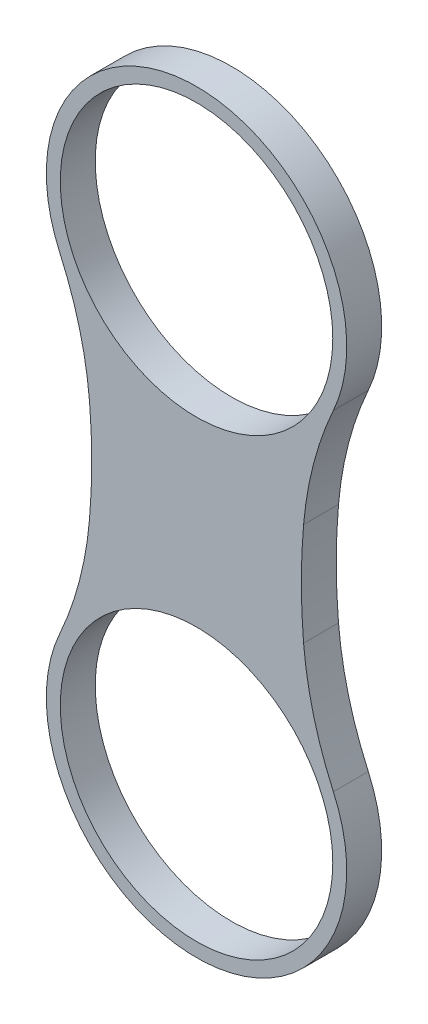
ISO-10303-21;
HEADER;
FILE_DESCRIPTION(('STEP AP214'),'2;1');
FILE_NAME('part.step','',(''),(''),'','','');
FILE_SCHEMA(('AUTOMOTIVE_DESIGN { 1 0 10303 214 1 1 1 1 }'));
ENDSEC;
DATA;
#1=APPLICATION_CONTEXT('core data for automotive mechanical design processes');
#2=APPLICATION_PROTOCOL_DEFINITION('international standard','automotive_design',2000,#1);
#3=PRODUCT_CONTEXT('',#1,'mechanical');
#4=PRODUCT('Part','Part','',(#3));
#5=PRODUCT_RELATED_PRODUCT_CATEGORY('part','',(#4));
#6=PRODUCT_DEFINITION_FORMATION('','',#4);
#7=PRODUCT_DEFINITION_CONTEXT('part definition',#1,'design');
#8=PRODUCT_DEFINITION('design','',#6,#7);
#9=PRODUCT_DEFINITION_SHAPE('','',#8);
#10=(LENGTH_UNIT() NAMED_UNIT(*) SI_UNIT(.MILLI.,.METRE.));
#11=(NAMED_UNIT(*) PLANE_ANGLE_UNIT() SI_UNIT($,.RADIAN.));
#12=(NAMED_UNIT(*) SI_UNIT($,.STERADIAN.) SOLID_ANGLE_UNIT());
#13=UNCERTAINTY_MEASURE_WITH_UNIT(LENGTH_MEASURE(1.E-05),#10,'distance_accuracy_value','');
#14=(GEOMETRIC_REPRESENTATION_CONTEXT(3) GLOBAL_UNCERTAINTY_ASSIGNED_CONTEXT((#13)) GLOBAL_UNIT_ASSIGNED_CONTEXT((#10,
#11,#12)) REPRESENTATION_CONTEXT('',''));
#15=CARTESIAN_POINT('',(0.,0.,0.));
#16=DIRECTION('',(0.,0.,1.));
#17=DIRECTION('',(1.,0.,0.));
#18=AXIS2_PLACEMENT_3D('',#15,#16,#17);
#19=CARTESIAN_POINT('',(-16.4630692871983,-6.80001212542255,1.));
#20=DIRECTION('',(0.,0.,1.));
#21=DIRECTION('',(1.,0.,0.));
#22=AXIS2_PLACEMENT_3D('',#19,#20,#21);
#23=PLANE('',#22);
#24=CARTESIAN_POINT('',(0.,0.,1.));
#25=DIRECTION('',(0.,0.,1.));
#26=DIRECTION('',(1.,0.,0.));
#27=AXIS2_PLACEMENT_3D('',#24,#25,#26);
#28=CIRCLE('',#27,3.9);
#29=CARTESIAN_POINT('',(3.9,0.,1.));
#30=VERTEX_POINT('',#29);
#31=EDGE_CURVE('E131',#30,#30,#28,.T.);
#32=ORIENTED_EDGE('',*,*,#31,.F.);
#33=EDGE_LOOP('',(#32));
#34=FACE_BOUND('',#33,.T.);
#35=CARTESIAN_POINT('',(-13.0261385743966,-7.10002425084513,1.));
#36=DIRECTION('',(0.,0.,-1.));
#37=DIRECTION('',(1.,0.,0.));
#38=AXIS2_PLACEMENT_3D('',#35,#36,#37);
#39=CIRCLE('',#38,10.);
#40=CARTESIAN_POINT('',(-3.06402056627586,-7.96962461438884,1.));
#41=VERTEX_POINT('',#40);
#42=CARTESIAN_POINT('',(-3.91695076013326,-11.2258814180863,1.));
#43=VERTEX_POINT('',#42);
#44=EDGE_CURVE('E142',#41,#43,#39,.T.);
#45=ORIENTED_EDGE('',*,*,#44,.T.);
#46=CARTESIAN_POINT('',(0.,-13.,1.));
#47=DIRECTION('',(0.,0.,1.));
#48=DIRECTION('',(1.,0.,0.));
#49=AXIS2_PLACEMENT_3D('',#46,#47,#48);
#50=CIRCLE('',#49,4.3);
#51=CARTESIAN_POINT('',(3.91695076013326,-11.2258814180863,1.));
#52=VERTEX_POINT('',#51);
#53=EDGE_CURVE('E90',#43,#52,#50,.T.);
#54=ORIENTED_EDGE('',*,*,#53,.T.);
#55=CARTESIAN_POINT('',(13.0261385743967,-7.10002425084514,1.));
#56=DIRECTION('',(0.,0.,-1.));
#57=DIRECTION('',(1.,0.,0.));
#58=AXIS2_PLACEMENT_3D('',#55,#56,#57);
#59=CIRCLE('',#58,10.);
#60=CARTESIAN_POINT('',(3.06402056627586,-7.96962461438883,1.));
#61=VERTEX_POINT('',#60);
#62=EDGE_CURVE('E157',#52,#61,#59,.T.);
#63=ORIENTED_EDGE('',*,*,#62,.T.);
#64=CARTESIAN_POINT('',(19.9,-6.49999999999999,1.));
#65=DIRECTION('',(0.,0.,-1.));
#66=DIRECTION('',(1.,0.,0.));
#67=AXIS2_PLACEMENT_3D('',#64,#65,#66);
#68=CIRCLE('',#67,16.9);
#69=CARTESIAN_POINT('',(3.06402056627585,-5.03037538561117,1.));
#70=VERTEX_POINT('',#69);
#71=EDGE_CURVE('E170',#61,#70,#68,.T.);
#72=ORIENTED_EDGE('',*,*,#71,.T.);
#73=CARTESIAN_POINT('',(13.0261385743967,-5.89997574915485,1.));
#74=DIRECTION('',(0.,0.,-1.));
#75=DIRECTION('',(1.,0.,0.));
#76=AXIS2_PLACEMENT_3D('',#73,#74,#75);
#77=CIRCLE('',#76,10.);
#78=CARTESIAN_POINT('',(3.91695076013326,-1.77411858191369,1.));
#79=VERTEX_POINT('',#78);
#80=EDGE_CURVE('E109',#70,#79,#77,.T.);
#81=ORIENTED_EDGE('',*,*,#80,.T.);
#82=CARTESIAN_POINT('',(0.,0.,1.));
#83=DIRECTION('',(0.,0.,1.));
#84=DIRECTION('',(1.,0.,0.));
#85=AXIS2_PLACEMENT_3D('',#82,#83,#84);
#86=CIRCLE('',#85,4.29999999999999);
#87=CARTESIAN_POINT('',(-3.91695076013325,-1.7741185819137,1.));
#88=VERTEX_POINT('',#87);
#89=EDGE_CURVE('E103',#79,#88,#86,.T.);
#90=ORIENTED_EDGE('',*,*,#89,.T.);
#91=CARTESIAN_POINT('',(-13.0261385743966,-5.89997574915487,1.));
#92=DIRECTION('',(0.,0.,-1.));
#93=DIRECTION('',(1.,0.,0.));
#94=AXIS2_PLACEMENT_3D('',#91,#92,#93);
#95=CIRCLE('',#94,10.);
#96=CARTESIAN_POINT('',(-3.06402056627584,-5.03037538561125,1.));
#97=VERTEX_POINT('',#96);
#98=EDGE_CURVE('E107',#88,#97,#95,.T.);
#99=ORIENTED_EDGE('',*,*,#98,.T.);
#100=CARTESIAN_POINT('',(-19.9,-6.49999999999997,1.));
#101=DIRECTION('',(0.,0.,-1.));
#102=DIRECTION('',(-1.,0.,0.));
#103=AXIS2_PLACEMENT_3D('',#100,#101,#102);
#104=CIRCLE('',#103,16.9);
#105=EDGE_CURVE('E47',#97,#41,#104,.T.);
#106=ORIENTED_EDGE('',*,*,#105,.T.);
#107=EDGE_LOOP('',(#45,#54,#63,#72,#81,#90,#99,#106));
#108=FACE_BOUND('',#107,.T.);
#109=CARTESIAN_POINT('',(0.,-13.,1.));
#110=DIRECTION('',(0.,0.,1.));
#111=DIRECTION('',(1.,0.,0.));
#112=AXIS2_PLACEMENT_3D('',#109,#110,#111);
#113=CIRCLE('',#112,3.9);
#114=CARTESIAN_POINT('',(3.9,-13.,1.));
#115=VERTEX_POINT('',#114);
#116=EDGE_CURVE('E179',#115,#115,#113,.T.);
#117=ORIENTED_EDGE('',*,*,#116,.F.);
#118=EDGE_LOOP('',(#117));
#119=FACE_BOUND('',#118,.T.);
#120=ADVANCED_FACE('F30',(#34,#108,#119),#23,.T.);
#121=CARTESIAN_POINT('',(-16.4630692871983,-6.80001212542255,0.));
#122=DIRECTION('',(0.,0.,1.));
#123=DIRECTION('',(1.,0.,0.));
#124=AXIS2_PLACEMENT_3D('',#121,#122,#123);
#125=PLANE('',#124);
#126=CARTESIAN_POINT('',(0.,0.,0.));
#127=DIRECTION('',(0.,0.,1.));
#128=DIRECTION('',(1.,0.,0.));
#129=AXIS2_PLACEMENT_3D('',#126,#127,#128);
#130=CIRCLE('',#129,3.9);
#131=CARTESIAN_POINT('',(3.9,0.,0.));
#132=VERTEX_POINT('',#131);
#133=EDGE_CURVE('E176',#132,#132,#130,.T.);
#134=ORIENTED_EDGE('',*,*,#133,.T.);
#135=EDGE_LOOP('',(#134));
#136=FACE_BOUND('',#135,.T.);
#137=CARTESIAN_POINT('',(-13.0261385743966,-7.10002425084513,0.));
#138=DIRECTION('',(0.,0.,-1.));
#139=DIRECTION('',(1.,0.,0.));
#140=AXIS2_PLACEMENT_3D('',#137,#138,#139);
#141=CIRCLE('',#140,10.);
#142=CARTESIAN_POINT('',(-3.06402056627586,-7.96962461438884,0.));
#143=VERTEX_POINT('',#142);
#144=CARTESIAN_POINT('',(-3.91695076013326,-11.2258814180863,0.));
#145=VERTEX_POINT('',#144);
#146=EDGE_CURVE('E127',#143,#145,#141,.T.);
#147=ORIENTED_EDGE('',*,*,#146,.F.);
#148=CARTESIAN_POINT('',(-19.9,-6.49999999999997,0.));
#149=DIRECTION('',(0.,0.,-1.));
#150=DIRECTION('',(-1.,0.,0.));
#151=AXIS2_PLACEMENT_3D('',#148,#149,#150);
#152=CIRCLE('',#151,16.9);
#153=CARTESIAN_POINT('',(-3.06402056627584,-5.03037538561125,0.));
#154=VERTEX_POINT('',#153);
#155=EDGE_CURVE('E82',#154,#143,#152,.T.);
#156=ORIENTED_EDGE('',*,*,#155,.F.);
#157=CARTESIAN_POINT('',(-13.0261385743966,-5.89997574915487,0.));
#158=DIRECTION('',(0.,0.,-1.));
#159=DIRECTION('',(1.,0.,0.));
#160=AXIS2_PLACEMENT_3D('',#157,#158,#159);
#161=CIRCLE('',#160,10.);
#162=CARTESIAN_POINT('',(-3.91695076013325,-1.7741185819137,0.));
#163=VERTEX_POINT('',#162);
#164=EDGE_CURVE('E76',#163,#154,#161,.T.);
#165=ORIENTED_EDGE('',*,*,#164,.F.);
#166=CARTESIAN_POINT('',(0.,0.,0.));
#167=DIRECTION('',(0.,0.,1.));
#168=DIRECTION('',(1.,0.,0.));
#169=AXIS2_PLACEMENT_3D('',#166,#167,#168);
#170=CIRCLE('',#169,4.29999999999999);
#171=CARTESIAN_POINT('',(3.91695076013326,-1.77411858191369,0.));
#172=VERTEX_POINT('',#171);
#173=EDGE_CURVE('E117',#172,#163,#170,.T.);
#174=ORIENTED_EDGE('',*,*,#173,.F.);
#175=CARTESIAN_POINT('',(13.0261385743967,-5.89997574915485,0.));
#176=DIRECTION('',(0.,0.,-1.));
#177=DIRECTION('',(1.,0.,0.));
#178=AXIS2_PLACEMENT_3D('',#175,#176,#177);
#179=CIRCLE('',#178,10.);
#180=CARTESIAN_POINT('',(3.06402056627585,-5.03037538561117,0.));
#181=VERTEX_POINT('',#180);
#182=EDGE_CURVE('E137',#181,#172,#179,.T.);
#183=ORIENTED_EDGE('',*,*,#182,.F.);
#184=CARTESIAN_POINT('',(19.9,-6.49999999999999,0.));
#185=DIRECTION('',(0.,0.,-1.));
#186=DIRECTION('',(1.,0.,0.));
#187=AXIS2_PLACEMENT_3D('',#184,#185,#186);
#188=CIRCLE('',#187,16.9);
#189=CARTESIAN_POINT('',(3.06402056627586,-7.96962461438883,0.));
#190=VERTEX_POINT('',#189);
#191=EDGE_CURVE('E135',#190,#181,#188,.T.);
#192=ORIENTED_EDGE('',*,*,#191,.F.);
#193=CARTESIAN_POINT('',(13.0261385743967,-7.10002425084514,0.));
#194=DIRECTION('',(0.,0.,-1.));
#195=DIRECTION('',(1.,0.,0.));
#196=AXIS2_PLACEMENT_3D('',#193,#194,#195);
#197=CIRCLE('',#196,10.);
#198=CARTESIAN_POINT('',(3.91695076013326,-11.2258814180863,0.));
#199=VERTEX_POINT('',#198);
#200=EDGE_CURVE('E133',#199,#190,#197,.T.);
#201=ORIENTED_EDGE('',*,*,#200,.F.);
#202=CARTESIAN_POINT('',(0.,-13.,0.));
#203=DIRECTION('',(0.,0.,1.));
#204=DIRECTION('',(1.,0.,0.));
#205=AXIS2_PLACEMENT_3D('',#202,#203,#204);
#206=CIRCLE('',#205,4.3);
#207=EDGE_CURVE('E130',#145,#199,#206,.T.);
#208=ORIENTED_EDGE('',*,*,#207,.F.);
#209=EDGE_LOOP('',(#147,#156,#165,#174,#183,#192,#201,#208));
#210=FACE_BOUND('',#209,.T.);
#211=CARTESIAN_POINT('',(0.,-13.,0.));
#212=DIRECTION('',(0.,0.,1.));
#213=DIRECTION('',(1.,0.,0.));
#214=AXIS2_PLACEMENT_3D('',#211,#212,#213);
#215=CIRCLE('',#214,3.9);
#216=CARTESIAN_POINT('',(3.9,-13.,0.));
#217=VERTEX_POINT('',#216);
#218=EDGE_CURVE('E182',#217,#217,#215,.T.);
#219=ORIENTED_EDGE('',*,*,#218,.T.);
#220=EDGE_LOOP('',(#219));
#221=FACE_BOUND('',#220,.T.);
#222=ADVANCED_FACE('F161',(#136,#210,#221),#125,.F.);
#223=CARTESIAN_POINT('',(-13.0261385743966,-7.10002425084513,1.));
#224=DIRECTION('',(0.,0.,-1.));
#225=DIRECTION('',(-1.,0.,0.));
#226=AXIS2_PLACEMENT_3D('',#223,#224,#225);
#227=CYLINDRICAL_SURFACE('',#226,10.);
#228=ORIENTED_EDGE('',*,*,#146,.T.);
#229=DIRECTION('',(0.,0.,-1.));
#230=VECTOR('',#229,1.);
#231=CARTESIAN_POINT('',(-3.91695076013326,-11.2258814180863,1.));
#232=LINE('',#231,#230);
#233=EDGE_CURVE('E11',#43,#145,#232,.T.);
#234=ORIENTED_EDGE('',*,*,#233,.F.);
#235=ORIENTED_EDGE('',*,*,#44,.F.);
#236=DIRECTION('',(0.,0.,-1.));
#237=VECTOR('',#236,1.);
#238=CARTESIAN_POINT('',(-3.06402056627586,-7.96962461438884,1.));
#239=LINE('',#238,#237);
#240=EDGE_CURVE('E123',#41,#143,#239,.T.);
#241=ORIENTED_EDGE('',*,*,#240,.T.);
#242=EDGE_LOOP('',(#228,#234,#235,#241));
#243=FACE_BOUND('',#242,.T.);
#244=ADVANCED_FACE('F32',(#243),#227,.F.);
#245=CARTESIAN_POINT('',(0.,-13.,1.));
#246=DIRECTION('',(0.,0.,-1.));
#247=DIRECTION('',(-1.,0.,0.));
#248=AXIS2_PLACEMENT_3D('',#245,#246,#247);
#249=CYLINDRICAL_SURFACE('',#248,4.3);
#250=ORIENTED_EDGE('',*,*,#207,.T.);
#251=DIRECTION('',(0.,0.,-1.));
#252=VECTOR('',#251,1.);
#253=CARTESIAN_POINT('',(3.91695076013326,-11.2258814180863,1.));
#254=LINE('',#253,#252);
#255=EDGE_CURVE('E39',#52,#199,#254,.T.);
#256=ORIENTED_EDGE('',*,*,#255,.F.);
#257=ORIENTED_EDGE('',*,*,#53,.F.);
#258=ORIENTED_EDGE('',*,*,#233,.T.);
#259=EDGE_LOOP('',(#250,#256,#257,#258));
#260=FACE_BOUND('',#259,.T.);
#261=ADVANCED_FACE('F215',(#260),#249,.T.);
#262=CARTESIAN_POINT('',(13.0261385743967,-7.10002425084514,1.));
#263=DIRECTION('',(0.,0.,-1.));
#264=DIRECTION('',(-1.,0.,0.));
#265=AXIS2_PLACEMENT_3D('',#262,#263,#264);
#266=CYLINDRICAL_SURFACE('',#265,10.);
#267=ORIENTED_EDGE('',*,*,#200,.T.);
#268=DIRECTION('',(0.,0.,-1.));
#269=VECTOR('',#268,1.);
#270=CARTESIAN_POINT('',(3.06402056627586,-7.96962461438883,1.));
#271=LINE('',#270,#269);
#272=EDGE_CURVE('E149',#61,#190,#271,.T.);
#273=ORIENTED_EDGE('',*,*,#272,.F.);
#274=ORIENTED_EDGE('',*,*,#62,.F.);
#275=ORIENTED_EDGE('',*,*,#255,.T.);
#276=EDGE_LOOP('',(#267,#273,#274,#275));
#277=FACE_BOUND('',#276,.T.);
#278=ADVANCED_FACE('F155',(#277),#266,.F.);
#279=CARTESIAN_POINT('',(19.9,-6.49999999999999,1.));
#280=DIRECTION('',(0.,0.,-1.));
#281=DIRECTION('',(-1.,0.,0.));
#282=AXIS2_PLACEMENT_3D('',#279,#280,#281);
#283=CYLINDRICAL_SURFACE('',#282,16.9);
#284=ORIENTED_EDGE('',*,*,#191,.T.);
#285=DIRECTION('',(0.,0.,-1.));
#286=VECTOR('',#285,1.);
#287=CARTESIAN_POINT('',(3.06402056627585,-5.03037538561117,1.));
#288=LINE('',#287,#286);
#289=EDGE_CURVE('E146',#70,#181,#288,.T.);
#290=ORIENTED_EDGE('',*,*,#289,.F.);
#291=ORIENTED_EDGE('',*,*,#71,.F.);
#292=ORIENTED_EDGE('',*,*,#272,.T.);
#293=EDGE_LOOP('',(#284,#290,#291,#292));
#294=FACE_BOUND('',#293,.T.);
#295=ADVANCED_FACE('F166',(#294),#283,.F.);
#296=CARTESIAN_POINT('',(13.0261385743967,-5.89997574915485,1.));
#297=DIRECTION('',(0.,0.,-1.));
#298=DIRECTION('',(-1.,0.,0.));
#299=AXIS2_PLACEMENT_3D('',#296,#297,#298);
#300=CYLINDRICAL_SURFACE('',#299,10.);
#301=ORIENTED_EDGE('',*,*,#182,.T.);
#302=DIRECTION('',(0.,0.,-1.));
#303=VECTOR('',#302,1.);
#304=CARTESIAN_POINT('',(3.91695076013326,-1.77411858191369,1.));
#305=LINE('',#304,#303);
#306=EDGE_CURVE('E118',#79,#172,#305,.T.);
#307=ORIENTED_EDGE('',*,*,#306,.F.);
#308=ORIENTED_EDGE('',*,*,#80,.F.);
#309=ORIENTED_EDGE('',*,*,#289,.T.);
#310=EDGE_LOOP('',(#301,#307,#308,#309));
#311=FACE_BOUND('',#310,.T.);
#312=ADVANCED_FACE('F169',(#311),#300,.F.);
#313=CARTESIAN_POINT('',(0.,0.,1.));
#314=DIRECTION('',(0.,0.,-1.));
#315=DIRECTION('',(-1.,0.,0.));
#316=AXIS2_PLACEMENT_3D('',#313,#314,#315);
#317=CYLINDRICAL_SURFACE('',#316,4.29999999999999);
#318=ORIENTED_EDGE('',*,*,#173,.T.);
#319=DIRECTION('',(0.,0.,-1.));
#320=VECTOR('',#319,1.);
#321=CARTESIAN_POINT('',(-3.91695076013325,-1.7741185819137,1.));
#322=LINE('',#321,#320);
#323=EDGE_CURVE('E114',#88,#163,#322,.T.);
#324=ORIENTED_EDGE('',*,*,#323,.F.);
#325=ORIENTED_EDGE('',*,*,#89,.F.);
#326=ORIENTED_EDGE('',*,*,#306,.T.);
#327=EDGE_LOOP('',(#318,#324,#325,#326));
#328=FACE_BOUND('',#327,.T.);
#329=ADVANCED_FACE('F115',(#328),#317,.T.);
#330=CARTESIAN_POINT('',(-13.0261385743966,-5.89997574915487,1.));
#331=DIRECTION('',(0.,0.,-1.));
#332=DIRECTION('',(-1.,0.,0.));
#333=AXIS2_PLACEMENT_3D('',#330,#331,#332);
#334=CYLINDRICAL_SURFACE('',#333,10.);
#335=ORIENTED_EDGE('',*,*,#164,.T.);
#336=DIRECTION('',(0.,0.,-1.));
#337=VECTOR('',#336,1.);
#338=CARTESIAN_POINT('',(-3.06402056627584,-5.03037538561125,1.));
#339=LINE('',#338,#337);
#340=EDGE_CURVE('E119',#97,#154,#339,.T.);
#341=ORIENTED_EDGE('',*,*,#340,.F.);
#342=ORIENTED_EDGE('',*,*,#98,.F.);
#343=ORIENTED_EDGE('',*,*,#323,.T.);
#344=EDGE_LOOP('',(#335,#341,#342,#343));
#345=FACE_BOUND('',#344,.T.);
#346=ADVANCED_FACE('F121',(#345),#334,.F.);
#347=CARTESIAN_POINT('',(-19.9,-6.49999999999997,1.));
#348=DIRECTION('',(0.,0.,-1.));
#349=DIRECTION('',(-1.,0.,0.));
#350=AXIS2_PLACEMENT_3D('',#347,#348,#349);
#351=CYLINDRICAL_SURFACE('',#350,16.9);
#352=ORIENTED_EDGE('',*,*,#155,.T.);
#353=ORIENTED_EDGE('',*,*,#240,.F.);
#354=ORIENTED_EDGE('',*,*,#105,.F.);
#355=ORIENTED_EDGE('',*,*,#340,.T.);
#356=EDGE_LOOP('',(#352,#353,#354,#355));
#357=FACE_BOUND('',#356,.T.);
#358=ADVANCED_FACE('F203',(#357),#351,.F.);
#359=CARTESIAN_POINT('',(0.,0.,1.));
#360=DIRECTION('',(0.,0.,-1.));
#361=DIRECTION('',(-1.,0.,0.));
#362=AXIS2_PLACEMENT_3D('',#359,#360,#361);
#363=CYLINDRICAL_SURFACE('',#362,3.9);
#364=ORIENTED_EDGE('',*,*,#31,.T.);
#365=EDGE_LOOP('',(#364));
#366=FACE_BOUND('',#365,.T.);
#367=ORIENTED_EDGE('',*,*,#133,.F.);
#368=EDGE_LOOP('',(#367));
#369=FACE_BOUND('',#368,.T.);
#370=ADVANCED_FACE('F200',(#366,#369),#363,.F.);
#371=CARTESIAN_POINT('',(0.,-13.,1.));
#372=DIRECTION('',(0.,0.,-1.));
#373=DIRECTION('',(-1.,0.,0.));
#374=AXIS2_PLACEMENT_3D('',#371,#372,#373);
#375=CYLINDRICAL_SURFACE('',#374,3.9);
#376=ORIENTED_EDGE('',*,*,#116,.T.);
#377=EDGE_LOOP('',(#376));
#378=FACE_BOUND('',#377,.T.);
#379=ORIENTED_EDGE('',*,*,#218,.F.);
#380=EDGE_LOOP('',(#379));
#381=FACE_BOUND('',#380,.T.);
#382=ADVANCED_FACE('F188',(#378,#381),#375,.F.);
#383=CLOSED_SHELL('',(#120,#222,#244,#261,#278,#295,#312,#329,#346,#358,#370,#382));
#384=MANIFOLD_SOLID_BREP('B2',#383);
#385=ADVANCED_BREP_SHAPE_REPRESENTATION('',(#18,#384),#14);
#386=SHAPE_DEFINITION_REPRESENTATION(#9,#385);
ENDSEC;
END-ISO-10303-21;
